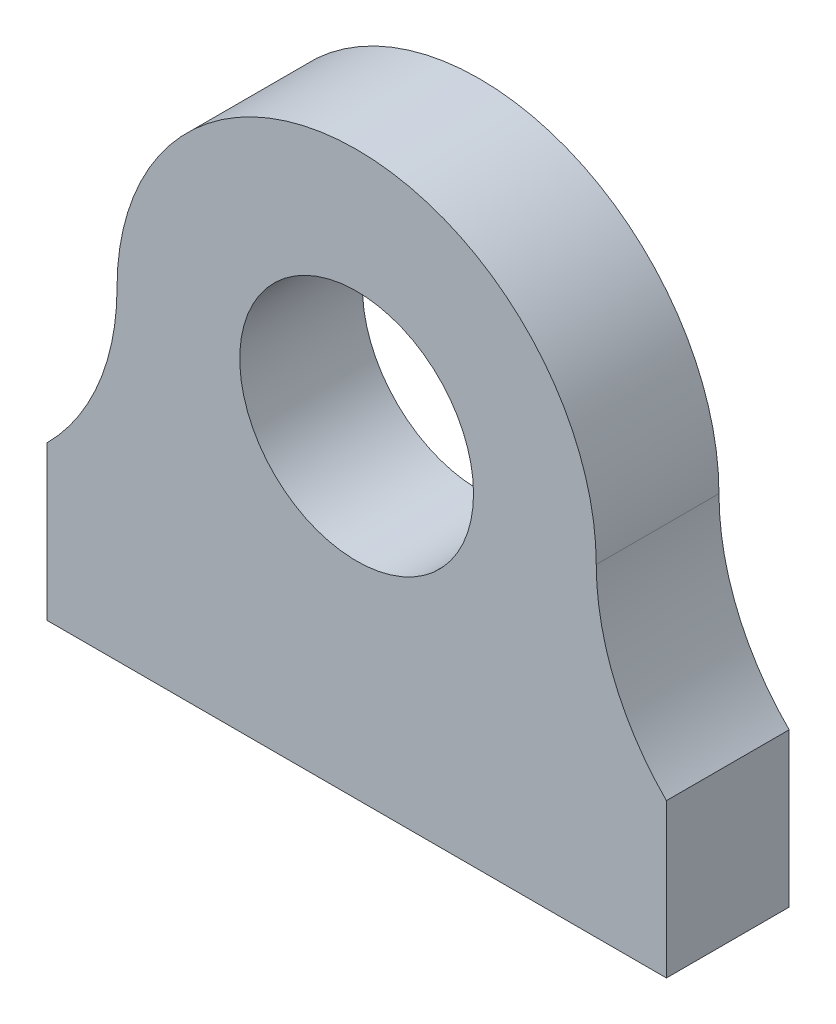
ISO-10303-21;
HEADER;
FILE_DESCRIPTION(('STEP AP214'),'2;1');
FILE_NAME('part.step','',(''),(''),'','','');
FILE_SCHEMA(('AUTOMOTIVE_DESIGN { 1 0 10303 214 1 1 1 1 }'));
ENDSEC;
DATA;
#1=APPLICATION_CONTEXT('core data for automotive mechanical design processes');
#2=APPLICATION_PROTOCOL_DEFINITION('international standard','automotive_design',2000,#1);
#3=PRODUCT_CONTEXT('',#1,'mechanical');
#4=PRODUCT('Part','Part','',(#3));
#5=PRODUCT_RELATED_PRODUCT_CATEGORY('part','',(#4));
#6=PRODUCT_DEFINITION_FORMATION('','',#4);
#7=PRODUCT_DEFINITION_CONTEXT('part definition',#1,'design');
#8=PRODUCT_DEFINITION('design','',#6,#7);
#9=PRODUCT_DEFINITION_SHAPE('','',#8);
#10=(LENGTH_UNIT() NAMED_UNIT(*) SI_UNIT(.MILLI.,.METRE.));
#11=(NAMED_UNIT(*) PLANE_ANGLE_UNIT() SI_UNIT($,.RADIAN.));
#12=(NAMED_UNIT(*) SI_UNIT($,.STERADIAN.) SOLID_ANGLE_UNIT());
#13=UNCERTAINTY_MEASURE_WITH_UNIT(LENGTH_MEASURE(1.E-05),#10,'distance_accuracy_value','');
#14=(GEOMETRIC_REPRESENTATION_CONTEXT(3) GLOBAL_UNCERTAINTY_ASSIGNED_CONTEXT((#13)) GLOBAL_UNIT_ASSIGNED_CONTEXT((#10,
#11,#12)) REPRESENTATION_CONTEXT('',''));
#15=CARTESIAN_POINT('',(0.,0.,0.));
#16=DIRECTION('',(0.,0.,1.));
#17=DIRECTION('',(1.,0.,0.));
#18=AXIS2_PLACEMENT_3D('',#15,#16,#17);
#19=CARTESIAN_POINT('',(-18.5019569058903,9.2,5.));
#20=DIRECTION('',(0.,0.,1.));
#21=DIRECTION('',(1.,0.,0.));
#22=AXIS2_PLACEMENT_3D('',#19,#20,#21);
#23=PLANE('',#22);
#24=CARTESIAN_POINT('',(-18.5019569058903,9.2,5.));
#25=DIRECTION('',(0.,0.,-1.));
#26=DIRECTION('',(1.,0.,0.));
#27=AXIS2_PLACEMENT_3D('',#24,#25,#26);
#28=CIRCLE('',#27,9.762);
#29=CARTESIAN_POINT('',(-8.73995690589026,9.2,5.));
#30=VERTEX_POINT('',#29);
#31=CARTESIAN_POINT('',(-11.5991805079472,2.29722360205692,5.));
#32=VERTEX_POINT('',#31);
#33=EDGE_CURVE('E129',#30,#32,#28,.T.);
#34=ORIENTED_EDGE('',*,*,#33,.T.);
#35=DIRECTION('',(0.,-1.,0.));
#36=VECTOR('',#35,1.);
#37=CARTESIAN_POINT('',(-11.5991805079472,2.29722360205692,5.));
#38=LINE('',#37,#36);
#39=CARTESIAN_POINT('',(-11.5991805079472,-3.96114247419632,5.));
#40=VERTEX_POINT('',#39);
#41=EDGE_CURVE('E87',#32,#40,#38,.T.);
#42=ORIENTED_EDGE('',*,*,#41,.T.);
#43=DIRECTION('',(1.,0.,0.));
#44=VECTOR('',#43,1.);
#45=CARTESIAN_POINT('',(-11.5991805079472,-3.96114247419632,5.));
#46=LINE('',#45,#44);
#47=CARTESIAN_POINT('',(13.6442666961667,-3.96114247419632,5.));
#48=VERTEX_POINT('',#47);
#49=EDGE_CURVE('E100',#40,#48,#46,.T.);
#50=ORIENTED_EDGE('',*,*,#49,.T.);
#51=DIRECTION('',(0.,1.,0.));
#52=VECTOR('',#51,1.);
#53=CARTESIAN_POINT('',(13.6442666961667,-0.562353553390594,5.));
#54=LINE('',#53,#52);
#55=CARTESIAN_POINT('',(13.6442666961667,2.29722360205692,5.));
#56=VERTEX_POINT('',#55);
#57=EDGE_CURVE('E94',#48,#56,#54,.T.);
#58=ORIENTED_EDGE('',*,*,#57,.T.);
#59=CARTESIAN_POINT('',(20.5470430941097,9.2,5.));
#60=DIRECTION('',(0.,0.,-1.));
#61=DIRECTION('',(-1.,0.,0.));
#62=AXIS2_PLACEMENT_3D('',#59,#60,#61);
#63=CIRCLE('',#62,9.762);
#64=CARTESIAN_POINT('',(10.7850430941097,9.2,5.));
#65=VERTEX_POINT('',#64);
#66=EDGE_CURVE('E98',#56,#65,#63,.T.);
#67=ORIENTED_EDGE('',*,*,#66,.T.);
#68=CARTESIAN_POINT('',(1.02254309410974,9.2,5.));
#69=DIRECTION('',(0.,0.,1.));
#70=DIRECTION('',(1.,0.,0.));
#71=AXIS2_PLACEMENT_3D('',#68,#69,#70);
#72=CIRCLE('',#71,9.7625);
#73=EDGE_CURVE('E50',#65,#30,#72,.T.);
#74=ORIENTED_EDGE('',*,*,#73,.T.);
#75=EDGE_LOOP('',(#34,#42,#50,#58,#67,#74));
#76=FACE_BOUND('',#75,.T.);
#77=CARTESIAN_POINT('',(1.02254309410974,9.2,5.));
#78=DIRECTION('',(0.,0.,1.));
#79=DIRECTION('',(1.,0.,0.));
#80=AXIS2_PLACEMENT_3D('',#77,#78,#79);
#81=CIRCLE('',#80,4.7625);
#82=CARTESIAN_POINT('',(5.78504309410974,9.2,5.));
#83=VERTEX_POINT('',#82);
#84=EDGE_CURVE('E121',#83,#83,#81,.T.);
#85=ORIENTED_EDGE('',*,*,#84,.F.);
#86=EDGE_LOOP('',(#85));
#87=FACE_BOUND('',#86,.T.);
#88=ADVANCED_FACE('F33',(#76,#87),#23,.T.);
#89=CARTESIAN_POINT('',(-18.5019569058903,9.2,0.));
#90=DIRECTION('',(0.,0.,1.));
#91=DIRECTION('',(1.,0.,0.));
#92=AXIS2_PLACEMENT_3D('',#89,#90,#91);
#93=PLANE('',#92);
#94=CARTESIAN_POINT('',(-18.5019569058903,9.2,0.));
#95=DIRECTION('',(0.,0.,-1.));
#96=DIRECTION('',(1.,0.,0.));
#97=AXIS2_PLACEMENT_3D('',#94,#95,#96);
#98=CIRCLE('',#97,9.762);
#99=CARTESIAN_POINT('',(-8.73995690589026,9.2,0.));
#100=VERTEX_POINT('',#99);
#101=CARTESIAN_POINT('',(-11.5991805079472,2.29722360205692,0.));
#102=VERTEX_POINT('',#101);
#103=EDGE_CURVE('E117',#100,#102,#98,.T.);
#104=ORIENTED_EDGE('',*,*,#103,.F.);
#105=CARTESIAN_POINT('',(1.02254309410974,9.2,0.));
#106=DIRECTION('',(0.,0.,1.));
#107=DIRECTION('',(1.,0.,0.));
#108=AXIS2_PLACEMENT_3D('',#105,#106,#107);
#109=CIRCLE('',#108,9.7625);
#110=CARTESIAN_POINT('',(10.7850430941097,9.2,0.));
#111=VERTEX_POINT('',#110);
#112=EDGE_CURVE('E79',#111,#100,#109,.T.);
#113=ORIENTED_EDGE('',*,*,#112,.F.);
#114=CARTESIAN_POINT('',(20.5470430941097,9.2,0.));
#115=DIRECTION('',(0.,0.,-1.));
#116=DIRECTION('',(-1.,0.,0.));
#117=AXIS2_PLACEMENT_3D('',#114,#115,#116);
#118=CIRCLE('',#117,9.762);
#119=CARTESIAN_POINT('',(13.6442666961667,2.29722360205692,0.));
#120=VERTEX_POINT('',#119);
#121=EDGE_CURVE('E73',#120,#111,#118,.T.);
#122=ORIENTED_EDGE('',*,*,#121,.F.);
#123=DIRECTION('',(0.,1.,0.));
#124=VECTOR('',#123,1.);
#125=CARTESIAN_POINT('',(13.6442666961667,2.29722360205692,0.));
#126=LINE('',#125,#124);
#127=CARTESIAN_POINT('',(13.6442666961667,-3.96114247419632,0.));
#128=VERTEX_POINT('',#127);
#129=EDGE_CURVE('E107',#128,#120,#126,.T.);
#130=ORIENTED_EDGE('',*,*,#129,.F.);
#131=DIRECTION('',(1.,0.,0.));
#132=VECTOR('',#131,1.);
#133=CARTESIAN_POINT('',(-11.5991805079472,-3.96114247419632,0.));
#134=LINE('',#133,#132);
#135=CARTESIAN_POINT('',(-11.5991805079472,-3.96114247419632,0.));
#136=VERTEX_POINT('',#135);
#137=EDGE_CURVE('E123',#136,#128,#134,.T.);
#138=ORIENTED_EDGE('',*,*,#137,.F.);
#139=DIRECTION('',(0.,-1.,0.));
#140=VECTOR('',#139,1.);
#141=CARTESIAN_POINT('',(-11.5991805079472,-0.562353553390594,0.));
#142=LINE('',#141,#140);
#143=EDGE_CURVE('E120',#102,#136,#142,.T.);
#144=ORIENTED_EDGE('',*,*,#143,.F.);
#145=EDGE_LOOP('',(#104,#113,#122,#130,#138,#144));
#146=FACE_BOUND('',#145,.T.);
#147=CARTESIAN_POINT('',(1.02254309410974,9.2,0.));
#148=DIRECTION('',(0.,0.,1.));
#149=DIRECTION('',(1.,0.,0.));
#150=AXIS2_PLACEMENT_3D('',#147,#148,#149);
#151=CIRCLE('',#150,4.7625);
#152=CARTESIAN_POINT('',(5.78504309410974,9.2,0.));
#153=VERTEX_POINT('',#152);
#154=EDGE_CURVE('E228',#153,#153,#151,.T.);
#155=ORIENTED_EDGE('',*,*,#154,.T.);
#156=EDGE_LOOP('',(#155));
#157=FACE_BOUND('',#156,.T.);
#158=ADVANCED_FACE('F138',(#146,#157),#93,.F.);
#159=CARTESIAN_POINT('',(-18.5019569058903,9.2,5.));
#160=DIRECTION('',(0.,0.,-1.));
#161=DIRECTION('',(-1.,0.,0.));
#162=AXIS2_PLACEMENT_3D('',#159,#160,#161);
#163=CYLINDRICAL_SURFACE('',#162,9.762);
#164=ORIENTED_EDGE('',*,*,#103,.T.);
#165=DIRECTION('',(0.,0.,-1.));
#166=VECTOR('',#165,1.);
#167=CARTESIAN_POINT('',(-11.5991805079472,2.29722360205692,5.));
#168=LINE('',#167,#166);
#169=EDGE_CURVE('E11',#32,#102,#168,.T.);
#170=ORIENTED_EDGE('',*,*,#169,.F.);
#171=ORIENTED_EDGE('',*,*,#33,.F.);
#172=DIRECTION('',(0.,0.,-1.));
#173=VECTOR('',#172,1.);
#174=CARTESIAN_POINT('',(-8.73995690589026,9.2,5.));
#175=LINE('',#174,#173);
#176=EDGE_CURVE('E113',#30,#100,#175,.T.);
#177=ORIENTED_EDGE('',*,*,#176,.T.);
#178=EDGE_LOOP('',(#164,#170,#171,#177));
#179=FACE_BOUND('',#178,.T.);
#180=ADVANCED_FACE('F35',(#179),#163,.F.);
#181=CARTESIAN_POINT('',(-11.5991805079472,-0.562353553390594,5.));
#182=DIRECTION('',(1.,0.,0.));
#183=DIRECTION('',(0.,0.,-1.));
#184=AXIS2_PLACEMENT_3D('',#181,#182,#183);
#185=PLANE('',#184);
#186=ORIENTED_EDGE('',*,*,#143,.T.);
#187=DIRECTION('',(0.,0.,-1.));
#188=VECTOR('',#187,1.);
#189=CARTESIAN_POINT('',(-11.5991805079472,-3.96114247419632,5.));
#190=LINE('',#189,#188);
#191=EDGE_CURVE('E42',#40,#136,#190,.T.);
#192=ORIENTED_EDGE('',*,*,#191,.F.);
#193=ORIENTED_EDGE('',*,*,#41,.F.);
#194=ORIENTED_EDGE('',*,*,#169,.T.);
#195=EDGE_LOOP('',(#186,#192,#193,#194));
#196=FACE_BOUND('',#195,.T.);
#197=ADVANCED_FACE('F163',(#196),#185,.F.);
#198=CARTESIAN_POINT('',(-11.5991805079472,-3.96114247419632,5.));
#199=DIRECTION('',(0.,1.,0.));
#200=DIRECTION('',(0.,0.,1.));
#201=AXIS2_PLACEMENT_3D('',#198,#199,#200);
#202=PLANE('',#201);
#203=ORIENTED_EDGE('',*,*,#137,.T.);
#204=DIRECTION('',(0.,0.,-1.));
#205=VECTOR('',#204,1.);
#206=CARTESIAN_POINT('',(13.6442666961667,-3.96114247419632,5.));
#207=LINE('',#206,#205);
#208=EDGE_CURVE('E108',#48,#128,#207,.T.);
#209=ORIENTED_EDGE('',*,*,#208,.F.);
#210=ORIENTED_EDGE('',*,*,#49,.F.);
#211=ORIENTED_EDGE('',*,*,#191,.T.);
#212=EDGE_LOOP('',(#203,#209,#210,#211));
#213=FACE_BOUND('',#212,.T.);
#214=ADVANCED_FACE('F135',(#213),#202,.F.);
#215=CARTESIAN_POINT('',(13.6442666961667,2.29722360205692,5.));
#216=DIRECTION('',(-1.,0.,0.));
#217=DIRECTION('',(0.,-1.,0.));
#218=AXIS2_PLACEMENT_3D('',#215,#216,#217);
#219=PLANE('',#218);
#220=ORIENTED_EDGE('',*,*,#129,.T.);
#221=DIRECTION('',(0.,0.,-1.));
#222=VECTOR('',#221,1.);
#223=CARTESIAN_POINT('',(13.6442666961667,2.29722360205692,5.));
#224=LINE('',#223,#222);
#225=EDGE_CURVE('E105',#56,#120,#224,.T.);
#226=ORIENTED_EDGE('',*,*,#225,.F.);
#227=ORIENTED_EDGE('',*,*,#57,.F.);
#228=ORIENTED_EDGE('',*,*,#208,.T.);
#229=EDGE_LOOP('',(#220,#226,#227,#228));
#230=FACE_BOUND('',#229,.T.);
#231=ADVANCED_FACE('F106',(#230),#219,.F.);
#232=CARTESIAN_POINT('',(20.5470430941097,9.2,5.));
#233=DIRECTION('',(0.,0.,-1.));
#234=DIRECTION('',(-1.,0.,0.));
#235=AXIS2_PLACEMENT_3D('',#232,#233,#234);
#236=CYLINDRICAL_SURFACE('',#235,9.762);
#237=ORIENTED_EDGE('',*,*,#121,.T.);
#238=DIRECTION('',(0.,0.,-1.));
#239=VECTOR('',#238,1.);
#240=CARTESIAN_POINT('',(10.7850430941097,9.2,5.));
#241=LINE('',#240,#239);
#242=EDGE_CURVE('E109',#65,#111,#241,.T.);
#243=ORIENTED_EDGE('',*,*,#242,.F.);
#244=ORIENTED_EDGE('',*,*,#66,.F.);
#245=ORIENTED_EDGE('',*,*,#225,.T.);
#246=EDGE_LOOP('',(#237,#243,#244,#245));
#247=FACE_BOUND('',#246,.T.);
#248=ADVANCED_FACE('F111',(#247),#236,.F.);
#249=CARTESIAN_POINT('',(1.02254309410974,9.2,5.));
#250=DIRECTION('',(0.,0.,-1.));
#251=DIRECTION('',(-1.,0.,0.));
#252=AXIS2_PLACEMENT_3D('',#249,#250,#251);
#253=CYLINDRICAL_SURFACE('',#252,9.7625);
#254=ORIENTED_EDGE('',*,*,#112,.T.);
#255=ORIENTED_EDGE('',*,*,#176,.F.);
#256=ORIENTED_EDGE('',*,*,#73,.F.);
#257=ORIENTED_EDGE('',*,*,#242,.T.);
#258=EDGE_LOOP('',(#254,#255,#256,#257));
#259=FACE_BOUND('',#258,.T.);
#260=ADVANCED_FACE('F143',(#259),#253,.T.);
#261=CARTESIAN_POINT('',(1.02254309410974,9.2,5.));
#262=DIRECTION('',(0.,0.,-1.));
#263=DIRECTION('',(-1.,0.,0.));
#264=AXIS2_PLACEMENT_3D('',#261,#262,#263);
#265=CYLINDRICAL_SURFACE('',#264,4.7625);
#266=ORIENTED_EDGE('',*,*,#84,.T.);
#267=EDGE_LOOP('',(#266));
#268=FACE_BOUND('',#267,.T.);
#269=ORIENTED_EDGE('',*,*,#154,.F.);
#270=EDGE_LOOP('',(#269));
#271=FACE_BOUND('',#270,.T.);
#272=ADVANCED_FACE('F145',(#268,#271),#265,.F.);
#273=CLOSED_SHELL('',(#88,#158,#180,#197,#214,#231,#248,#260,#272));
#274=MANIFOLD_SOLID_BREP('B2',#273);
#275=ADVANCED_BREP_SHAPE_REPRESENTATION('',(#18,#274),#14);
#276=SHAPE_DEFINITION_REPRESENTATION(#9,#275);
ENDSEC;
END-ISO-10303-21;
